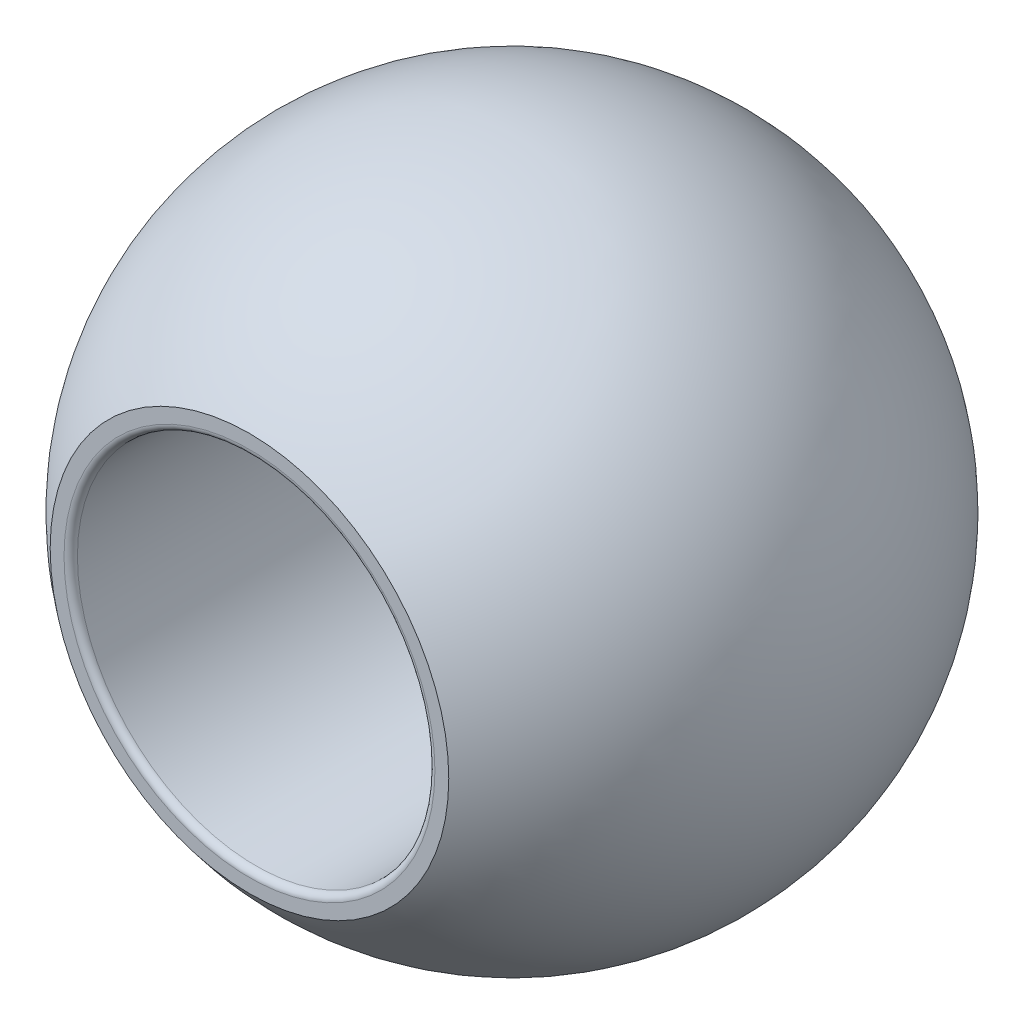
ISO-10303-21;
HEADER;
FILE_DESCRIPTION(('STEP AP214'),'2;1');
FILE_NAME('part.step','',(''),(''),'','','');
FILE_SCHEMA(('AUTOMOTIVE_DESIGN { 1 0 10303 214 1 1 1 1 }'));
ENDSEC;
DATA;
#1=APPLICATION_CONTEXT('core data for automotive mechanical design processes');
#2=APPLICATION_PROTOCOL_DEFINITION('international standard','automotive_design',2000,#1);
#3=PRODUCT_CONTEXT('',#1,'mechanical');
#4=PRODUCT('Part','Part','',(#3));
#5=PRODUCT_RELATED_PRODUCT_CATEGORY('part','',(#4));
#6=PRODUCT_DEFINITION_FORMATION('','',#4);
#7=PRODUCT_DEFINITION_CONTEXT('part definition',#1,'design');
#8=PRODUCT_DEFINITION('design','',#6,#7);
#9=PRODUCT_DEFINITION_SHAPE('','',#8);
#10=(LENGTH_UNIT() NAMED_UNIT(*) SI_UNIT(.MILLI.,.METRE.));
#11=(NAMED_UNIT(*) PLANE_ANGLE_UNIT() SI_UNIT($,.RADIAN.));
#12=(NAMED_UNIT(*) SI_UNIT($,.STERADIAN.) SOLID_ANGLE_UNIT());
#13=UNCERTAINTY_MEASURE_WITH_UNIT(LENGTH_MEASURE(1.E-05),#10,'distance_accuracy_value','');
#14=(GEOMETRIC_REPRESENTATION_CONTEXT(3) GLOBAL_UNCERTAINTY_ASSIGNED_CONTEXT((#13)) GLOBAL_UNIT_ASSIGNED_CONTEXT((#10,
#11,#12)) REPRESENTATION_CONTEXT('',''));
#15=CARTESIAN_POINT('',(0.,0.,0.));
#16=DIRECTION('',(0.,0.,1.));
#17=DIRECTION('',(1.,0.,0.));
#18=AXIS2_PLACEMENT_3D('',#15,#16,#17);
#19=CARTESIAN_POINT('',(0.,0.,0.));
#20=DIRECTION('',(0.,1.,0.));
#21=DIRECTION('',(1.,0.,0.));
#22=AXIS2_PLACEMENT_3D('',#19,#20,#21);
#23=SPHERICAL_SURFACE('',#22,2.95);
#24=CARTESIAN_POINT('',(0.,0.,0.));
#25=DIRECTION('',(0.,0.,1.));
#26=DIRECTION('',(1.,0.,0.));
#27=AXIS2_PLACEMENT_3D('',#24,#25,#26);
#28=SPHERICAL_SURFACE('',#27,2.95);
#29=CARTESIAN_POINT('',(0.,0.,-2.34939852644174));
#30=DIRECTION('',(0.,0.,1.));
#31=DIRECTION('',(1.,0.,0.));
#32=AXIS2_PLACEMENT_3D('',#29,#30,#31);
#33=CIRCLE('',#32,1.78404780315814);
#34=CARTESIAN_POINT('',(1.78404780315814,0.,-2.34939852644174));
#35=VERTEX_POINT('',#34);
#36=EDGE_CURVE('E50',#35,#35,#33,.F.);
#37=ORIENTED_EDGE('',*,*,#36,.F.);
#38=EDGE_LOOP('',(#37));
#39=FACE_BOUND('',#38,.T.);
#40=CARTESIAN_POINT('',(0.,0.,2.34939852644174));
#41=DIRECTION('',(0.,0.,1.));
#42=DIRECTION('',(1.,0.,0.));
#43=AXIS2_PLACEMENT_3D('',#40,#41,#42);
#44=CIRCLE('',#43,1.78404780315814);
#45=CARTESIAN_POINT('',(1.78404780315814,0.,2.34939852644174));
#46=VERTEX_POINT('',#45);
#47=EDGE_CURVE('E53',#46,#46,#44,.F.);
#48=ORIENTED_EDGE('',*,*,#47,.T.);
#49=EDGE_LOOP('',(#48));
#50=FACE_BOUND('',#49,.T.);
#51=ADVANCED_FACE('F30',(#39,#50),#28,.T.);
#52=CARTESIAN_POINT('',(0.,0.,2.951));
#53=DIRECTION('',(0.,0.,-1.));
#54=DIRECTION('',(-1.,0.,0.));
#55=AXIS2_PLACEMENT_3D('',#52,#53,#54);
#56=CYLINDRICAL_SURFACE('',#55,1.6);
#57=CARTESIAN_POINT('',(0.,0.,2.28939852644174));
#58=DIRECTION('',(0.,0.,1.));
#59=DIRECTION('',(1.,0.,0.));
#60=AXIS2_PLACEMENT_3D('',#57,#58,#59);
#61=CIRCLE('',#60,1.6);
#62=CARTESIAN_POINT('',(-1.6,0.,2.28939852644174));
#63=VERTEX_POINT('',#62);
#64=EDGE_CURVE('E37',#63,#63,#61,.T.);
#65=CARTESIAN_POINT('',(0.,0.,-2.28939852644174));
#66=DIRECTION('',(0.,0.,1.));
#67=DIRECTION('',(1.,0.,0.));
#68=AXIS2_PLACEMENT_3D('',#65,#66,#67);
#69=CIRCLE('',#68,1.6);
#70=CARTESIAN_POINT('',(-1.6,0.,-2.28939852644174));
#71=VERTEX_POINT('',#70);
#72=EDGE_CURVE('E41',#71,#71,#69,.F.);
#73=CARTESIAN_POINT('',(-1.6,0.,2.28939852644174));
#74=CARTESIAN_POINT('',(-1.6,0.,2.24170272380753));
#75=CARTESIAN_POINT('',(-1.6,0.,2.19400692117333));
#76=CARTESIAN_POINT('',(-1.6,0.,2.09861531590493));
#77=CARTESIAN_POINT('',(-1.6,0.,2.05091951327072));
#78=CARTESIAN_POINT('',(-1.6,0.,1.95552790800232));
#79=CARTESIAN_POINT('',(-1.6,0.,1.90783210536811));
#80=CARTESIAN_POINT('',(-1.6,0.,1.81244050009971));
#81=CARTESIAN_POINT('',(-1.6,0.,1.76474469746551));
#82=CARTESIAN_POINT('',(-1.6,0.,1.6693530921971));
#83=CARTESIAN_POINT('',(-1.6,0.,1.6216572895629));
#84=CARTESIAN_POINT('',(-1.6,0.,1.52626568429449));
#85=CARTESIAN_POINT('',(-1.6,0.,1.47856988166029));
#86=CARTESIAN_POINT('',(-1.6,0.,1.38317827639188));
#87=CARTESIAN_POINT('',(-1.6,0.,1.33548247375768));
#88=CARTESIAN_POINT('',(-1.6,0.,1.24009086848927));
#89=CARTESIAN_POINT('',(-1.6,0.,1.19239506585507));
#90=CARTESIAN_POINT('',(-1.6,0.,1.09700346058667));
#91=CARTESIAN_POINT('',(-1.6,0.,1.04930765795246));
#92=CARTESIAN_POINT('',(-1.6,0.,0.953916052684057));
#93=CARTESIAN_POINT('',(-1.6,0.,0.906220250049855));
#94=CARTESIAN_POINT('',(-1.6,0.,0.810828644781449));
#95=CARTESIAN_POINT('',(-1.6,0.,0.763132842147246));
#96=CARTESIAN_POINT('',(-1.6,0.,0.66774123687884));
#97=CARTESIAN_POINT('',(-1.6,0.,0.620045434244637));
#98=CARTESIAN_POINT('',(-1.6,0.,0.524653828976231));
#99=CARTESIAN_POINT('',(-1.6,0.,0.476958026342029));
#100=CARTESIAN_POINT('',(-1.6,0.,0.381566421073623));
#101=CARTESIAN_POINT('',(-1.6,0.,0.33387061843942));
#102=CARTESIAN_POINT('',(-1.6,0.,0.238479013171014));
#103=CARTESIAN_POINT('',(-1.6,0.,0.190783210536811));
#104=CARTESIAN_POINT('',(-1.6,0.,0.0953916052684056));
#105=CARTESIAN_POINT('',(-1.6,0.,0.0476958026342028));
#106=CARTESIAN_POINT('',(-1.6,0.,-0.0476958026342028));
#107=CARTESIAN_POINT('',(-1.6,0.,-0.0953916052684057));
#108=CARTESIAN_POINT('',(-1.6,0.,-0.190783210536811));
#109=CARTESIAN_POINT('',(-1.6,0.,-0.238479013171014));
#110=CARTESIAN_POINT('',(-1.6,0.,-0.33387061843942));
#111=CARTESIAN_POINT('',(-1.6,0.,-0.381566421073623));
#112=CARTESIAN_POINT('',(-1.6,0.,-0.476958026342029));
#113=CARTESIAN_POINT('',(-1.6,0.,-0.524653828976232));
#114=CARTESIAN_POINT('',(-1.6,0.,-0.620045434244638));
#115=CARTESIAN_POINT('',(-1.6,0.,-0.66774123687884));
#116=CARTESIAN_POINT('',(-1.6,0.,-0.763132842147246));
#117=CARTESIAN_POINT('',(-1.6,0.,-0.810828644781449));
#118=CARTESIAN_POINT('',(-1.6,0.,-0.906220250049855));
#119=CARTESIAN_POINT('',(-1.6,0.,-0.953916052684057));
#120=CARTESIAN_POINT('',(-1.6,0.,-1.04930765795246));
#121=CARTESIAN_POINT('',(-1.6,0.,-1.09700346058667));
#122=CARTESIAN_POINT('',(-1.6,0.,-1.19239506585507));
#123=CARTESIAN_POINT('',(-1.6,0.,-1.24009086848927));
#124=CARTESIAN_POINT('',(-1.6,0.,-1.33548247375768));
#125=CARTESIAN_POINT('',(-1.6,0.,-1.38317827639188));
#126=CARTESIAN_POINT('',(-1.6,0.,-1.47856988166029));
#127=CARTESIAN_POINT('',(-1.6,0.,-1.52626568429449));
#128=CARTESIAN_POINT('',(-1.6,0.,-1.6216572895629));
#129=CARTESIAN_POINT('',(-1.6,0.,-1.6693530921971));
#130=CARTESIAN_POINT('',(-1.6,0.,-1.76474469746551));
#131=CARTESIAN_POINT('',(-1.6,0.,-1.81244050009971));
#132=CARTESIAN_POINT('',(-1.6,0.,-1.90783210536812));
#133=CARTESIAN_POINT('',(-1.6,0.,-1.95552790800232));
#134=CARTESIAN_POINT('',(-1.6,0.,-2.05091951327072));
#135=CARTESIAN_POINT('',(-1.6,0.,-2.09861531590493));
#136=CARTESIAN_POINT('',(-1.6,0.,-2.19400692117333));
#137=CARTESIAN_POINT('',(-1.6,0.,-2.24170272380754));
#138=CARTESIAN_POINT('',(-1.6,0.,-2.28939852644174));
#139=B_SPLINE_CURVE_WITH_KNOTS('',3,(#73,#74,#75,#76,#77,#78,#79,#80,#81,#82,#83,#84,#85,#86,
#87,#88,#89,#90,#91,#92,#93,#94,#95,#96,#97,#98,#99,#100,#101,#102,#103,#104,#105,#106,#107,
#108,#109,#110,#111,#112,#113,#114,#115,#116,#117,#118,#119,#120,#121,#122,#123,#124,#125,#126,
#127,#128,#129,#130,#131,#132,#133,#134,#135,#136,#137,#138),.UNSPECIFIED.,.F.,.F.,(4,2,2,2,2,2,
2,2,2,2,2,2,2,2,2,2,2,2,2,2,2,2,2,2,2,2,2,2,2,2,2,2,4),(0.,0.143087407902608,0.286174815805217,
0.429262223707826,0.572349631610434,0.715437039513043,0.858524447415651,1.00161185531826,
1.14469926322087,1.28778667112348,1.43087407902609,1.57396148692869,1.7170488948313,
1.86013630273391,2.00322371063652,2.14631111853913,2.28939852644174,2.43248593434435,
2.57557334224696,2.71866075014956,2.86174815805217,3.00483556595478,3.14792297385739,
3.29101038176,3.43409778966261,3.57718519756521,3.72027260546782,3.86336001337043,
4.00644742127304,4.14953482917565,4.29262223707826,4.43570964498087,4.57879705288348),.UNSPECIFIED.);
#140=EDGE_CURVE('BSEAM71',#63,#71,#139,.T.);
#141=ORIENTED_EDGE('',*,*,#64,.T.);
#142=ORIENTED_EDGE('',*,*,#72,.T.);
#143=ORIENTED_EDGE('',*,*,#140,.T.);
#144=ORIENTED_EDGE('',*,*,#140,.F.);
#145=EDGE_LOOP('',(#141,#143,#142,#144));
#146=FACE_BOUND('',#145,.T.);
#147=ADVANCED_FACE('F71',(#146),#56,.F.);
#148=CARTESIAN_POINT('',(1.93853192526476,-2.95,-2.34939852644174));
#149=DIRECTION('',(0.,0.,1.));
#150=DIRECTION('',(1.,0.,0.));
#151=AXIS2_PLACEMENT_3D('',#148,#149,#150);
#152=PLANE('',#151);
#153=CARTESIAN_POINT('',(0.,0.,-2.34939852644174));
#154=DIRECTION('',(0.,0.,1.));
#155=DIRECTION('',(1.,0.,0.));
#156=AXIS2_PLACEMENT_3D('',#153,#154,#155);
#157=CIRCLE('',#156,1.66);
#158=CARTESIAN_POINT('',(1.66,0.,-2.34939852644174));
#159=VERTEX_POINT('',#158);
#160=EDGE_CURVE('E45',#159,#159,#157,.T.);
#161=ORIENTED_EDGE('',*,*,#160,.T.);
#162=EDGE_LOOP('',(#161));
#163=FACE_BOUND('',#162,.T.);
#164=ORIENTED_EDGE('',*,*,#36,.T.);
#165=EDGE_LOOP('',(#164));
#166=FACE_BOUND('',#165,.T.);
#167=ADVANCED_FACE('F67',(#163,#166),#152,.F.);
#168=CARTESIAN_POINT('',(0.,0.,-2.28939852644174));
#169=DIRECTION('',(0.,0.,1.));
#170=DIRECTION('',(1.,0.,0.));
#171=AXIS2_PLACEMENT_3D('',#168,#169,#170);
#172=TOROIDAL_SURFACE('',#171,1.66,0.06);
#173=ORIENTED_EDGE('',*,*,#72,.F.);
#174=EDGE_LOOP('',(#173));
#175=FACE_BOUND('',#174,.T.);
#176=ORIENTED_EDGE('',*,*,#160,.F.);
#177=EDGE_LOOP('',(#176));
#178=FACE_BOUND('',#177,.T.);
#179=ADVANCED_FACE('F60',(#175,#178),#172,.T.);
#180=CARTESIAN_POINT('',(1.93853192526476,-2.95,2.34939852644174));
#181=DIRECTION('',(0.,0.,1.));
#182=DIRECTION('',(1.,0.,0.));
#183=AXIS2_PLACEMENT_3D('',#180,#181,#182);
#184=PLANE('',#183);
#185=CARTESIAN_POINT('',(0.,0.,2.34939852644174));
#186=DIRECTION('',(0.,0.,1.));
#187=DIRECTION('',(1.,0.,0.));
#188=AXIS2_PLACEMENT_3D('',#185,#186,#187);
#189=CIRCLE('',#188,1.66);
#190=CARTESIAN_POINT('',(1.66,0.,2.34939852644174));
#191=VERTEX_POINT('',#190);
#192=EDGE_CURVE('E10',#191,#191,#189,.F.);
#193=ORIENTED_EDGE('',*,*,#192,.T.);
#194=EDGE_LOOP('',(#193));
#195=FACE_BOUND('',#194,.T.);
#196=ORIENTED_EDGE('',*,*,#47,.F.);
#197=EDGE_LOOP('',(#196));
#198=FACE_BOUND('',#197,.T.);
#199=ADVANCED_FACE('F58',(#195,#198),#184,.T.);
#200=CARTESIAN_POINT('',(0.,0.,2.28939852644174));
#201=DIRECTION('',(0.,0.,1.));
#202=DIRECTION('',(1.,0.,0.));
#203=AXIS2_PLACEMENT_3D('',#200,#201,#202);
#204=TOROIDAL_SURFACE('',#203,1.66,0.06);
#205=ORIENTED_EDGE('',*,*,#192,.F.);
#206=EDGE_LOOP('',(#205));
#207=FACE_BOUND('',#206,.T.);
#208=ORIENTED_EDGE('',*,*,#64,.F.);
#209=EDGE_LOOP('',(#208));
#210=FACE_BOUND('',#209,.T.);
#211=ADVANCED_FACE('F32',(#207,#210),#204,.T.);
#212=CLOSED_SHELL('',(#51,#147,#167,#179,#199,#211));
#213=MANIFOLD_SOLID_BREP('B2',#212);
#214=ADVANCED_BREP_SHAPE_REPRESENTATION('',(#18,#213),#14);
#215=SHAPE_DEFINITION_REPRESENTATION(#9,#214);
ENDSEC;
END-ISO-10303-21;
